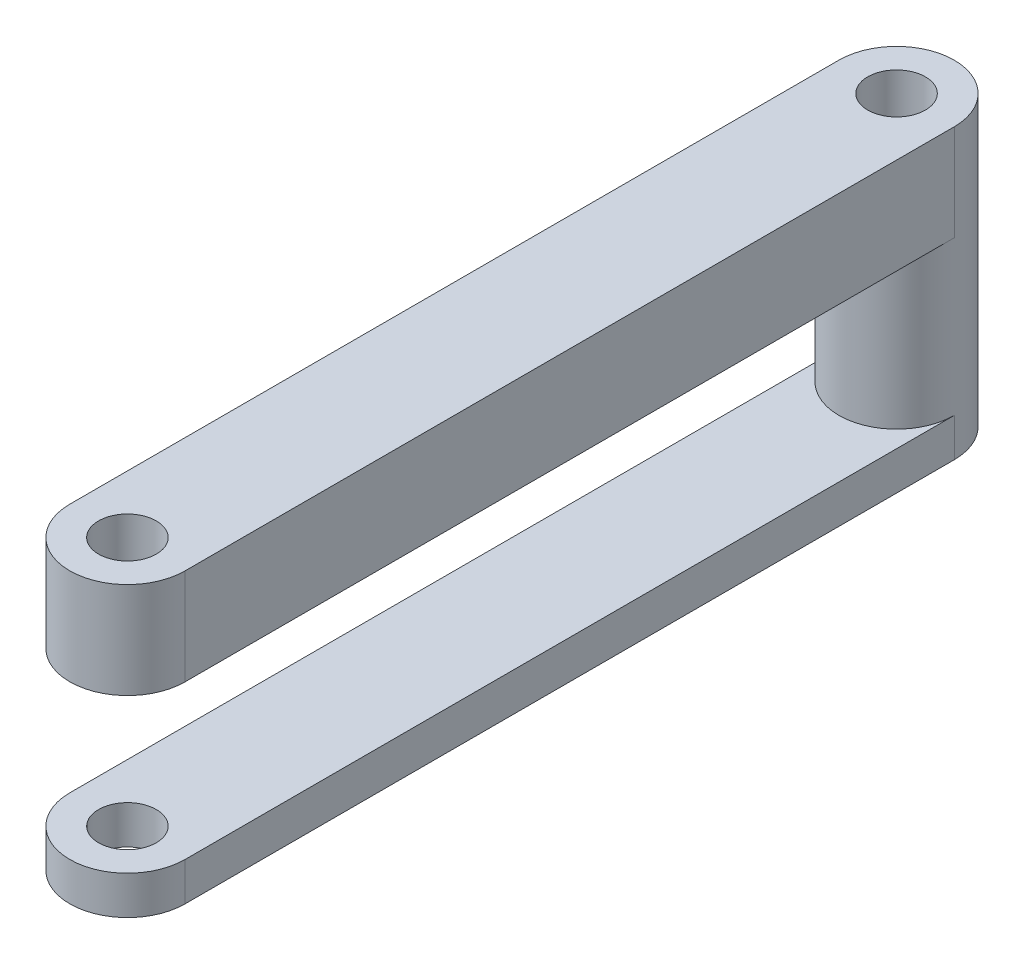
ISO-10303-21;
HEADER;
FILE_DESCRIPTION(('STEP AP214'),'2;1');
FILE_NAME('part.step','',(''),(''),'','','');
FILE_SCHEMA(('AUTOMOTIVE_DESIGN { 1 0 10303 214 1 1 1 1 }'));
ENDSEC;
DATA;
#1=APPLICATION_CONTEXT('core data for automotive mechanical design processes');
#2=APPLICATION_PROTOCOL_DEFINITION('international standard','automotive_design',2000,#1);
#3=PRODUCT_CONTEXT('',#1,'mechanical');
#4=PRODUCT('Part','Part','',(#3));
#5=PRODUCT_RELATED_PRODUCT_CATEGORY('part','',(#4));
#6=PRODUCT_DEFINITION_FORMATION('','',#4);
#7=PRODUCT_DEFINITION_CONTEXT('part definition',#1,'design');
#8=PRODUCT_DEFINITION('design','',#6,#7);
#9=PRODUCT_DEFINITION_SHAPE('','',#8);
#10=(LENGTH_UNIT() NAMED_UNIT(*) SI_UNIT(.MILLI.,.METRE.));
#11=(NAMED_UNIT(*) PLANE_ANGLE_UNIT() SI_UNIT($,.RADIAN.));
#12=(NAMED_UNIT(*) SI_UNIT($,.STERADIAN.) SOLID_ANGLE_UNIT());
#13=UNCERTAINTY_MEASURE_WITH_UNIT(LENGTH_MEASURE(1.E-05),#10,'distance_accuracy_value','');
#14=(GEOMETRIC_REPRESENTATION_CONTEXT(3) GLOBAL_UNCERTAINTY_ASSIGNED_CONTEXT((#13)) GLOBAL_UNIT_ASSIGNED_CONTEXT((#10,
#11,#12)) REPRESENTATION_CONTEXT('',''));
#15=CARTESIAN_POINT('',(0.,0.,0.));
#16=DIRECTION('',(0.,0.,1.));
#17=DIRECTION('',(1.,0.,0.));
#18=AXIS2_PLACEMENT_3D('',#15,#16,#17);
#19=CARTESIAN_POINT('',(0.,2.,0.));
#20=DIRECTION('',(0.,-1.,0.));
#21=DIRECTION('',(0.,0.,-1.));
#22=AXIS2_PLACEMENT_3D('',#19,#20,#21);
#23=CYLINDRICAL_SURFACE('',#22,3.);
#24=CARTESIAN_POINT('',(0.,0.,0.));
#25=DIRECTION('',(0.,1.,0.));
#26=DIRECTION('',(0.,0.,1.));
#27=AXIS2_PLACEMENT_3D('',#24,#25,#26);
#28=CIRCLE('',#27,3.);
#29=CARTESIAN_POINT('',(3.,0.,0.));
#30=VERTEX_POINT('',#29);
#31=CARTESIAN_POINT('',(-3.,0.,0.));
#32=VERTEX_POINT('',#31);
#33=EDGE_CURVE('E112',#30,#32,#28,.T.);
#34=ORIENTED_EDGE('',*,*,#33,.T.);
#35=DIRECTION('',(0.,-1.,0.));
#36=VECTOR('',#35,1.);
#37=CARTESIAN_POINT('',(-3.,2.,0.));
#38=LINE('',#37,#36);
#39=CARTESIAN_POINT('',(-3.,2.,0.));
#40=VERTEX_POINT('',#39);
#41=EDGE_CURVE('E123',#40,#32,#38,.T.);
#42=ORIENTED_EDGE('',*,*,#41,.F.);
#43=CARTESIAN_POINT('',(0.,2.,0.));
#44=DIRECTION('',(0.,1.,0.));
#45=DIRECTION('',(0.,0.,1.));
#46=AXIS2_PLACEMENT_3D('',#43,#44,#45);
#47=CIRCLE('',#46,3.);
#48=CARTESIAN_POINT('',(3.,2.,0.));
#49=VERTEX_POINT('',#48);
#50=EDGE_CURVE('E41',#40,#49,#47,.T.);
#51=ORIENTED_EDGE('',*,*,#50,.T.);
#52=DIRECTION('',(0.,-1.,0.));
#53=VECTOR('',#52,1.);
#54=CARTESIAN_POINT('',(3.,2.,0.));
#55=LINE('',#54,#53);
#56=EDGE_CURVE('E131',#49,#30,#55,.T.);
#57=ORIENTED_EDGE('',*,*,#56,.T.);
#58=EDGE_LOOP('',(#34,#42,#51,#57));
#59=FACE_BOUND('',#58,.T.);
#60=CARTESIAN_POINT('',(0.,10.,0.));
#61=DIRECTION('',(0.,1.,0.));
#62=DIRECTION('',(0.,0.,1.));
#63=AXIS2_PLACEMENT_3D('',#60,#61,#62);
#64=CIRCLE('',#63,3.);
#65=CARTESIAN_POINT('',(-3.,10.,0.));
#66=VERTEX_POINT('',#65);
#67=CARTESIAN_POINT('',(3.,10.,0.));
#68=VERTEX_POINT('',#67);
#69=EDGE_CURVE('E11',#66,#68,#64,.T.);
#70=ORIENTED_EDGE('',*,*,#69,.F.);
#71=DIRECTION('',(0.,-1.,0.));
#72=VECTOR('',#71,1.);
#73=CARTESIAN_POINT('',(-3.,15.,0.));
#74=LINE('',#73,#72);
#75=CARTESIAN_POINT('',(-3.,15.,0.));
#76=VERTEX_POINT('',#75);
#77=EDGE_CURVE('E55',#76,#66,#74,.T.);
#78=ORIENTED_EDGE('',*,*,#77,.F.);
#79=CARTESIAN_POINT('',(0.,15.,0.));
#80=DIRECTION('',(0.,1.,0.));
#81=DIRECTION('',(0.,0.,1.));
#82=AXIS2_PLACEMENT_3D('',#79,#80,#81);
#83=CIRCLE('',#82,3.);
#84=CARTESIAN_POINT('',(3.,15.,0.));
#85=VERTEX_POINT('',#84);
#86=EDGE_CURVE('E103',#85,#76,#83,.T.);
#87=ORIENTED_EDGE('',*,*,#86,.F.);
#88=DIRECTION('',(0.,-1.,0.));
#89=VECTOR('',#88,1.);
#90=CARTESIAN_POINT('',(3.,15.,0.));
#91=LINE('',#90,#89);
#92=EDGE_CURVE('E48',#85,#68,#91,.T.);
#93=ORIENTED_EDGE('',*,*,#92,.T.);
#94=EDGE_LOOP('',(#70,#78,#87,#93));
#95=FACE_BOUND('',#94,.T.);
#96=ADVANCED_FACE('F33',(#59,#95),#23,.T.);
#97=CARTESIAN_POINT('',(-3.,2.,0.));
#98=DIRECTION('',(1.,0.,0.));
#99=DIRECTION('',(0.,0.,-1.));
#100=AXIS2_PLACEMENT_3D('',#97,#98,#99);
#101=PLANE('',#100);
#102=DIRECTION('',(0.,0.,1.));
#103=VECTOR('',#102,1.);
#104=CARTESIAN_POINT('',(-3.,0.,0.));
#105=LINE('',#104,#103);
#106=CARTESIAN_POINT('',(-3.,0.,40.));
#107=VERTEX_POINT('',#106);
#108=EDGE_CURVE('E115',#32,#107,#105,.T.);
#109=ORIENTED_EDGE('',*,*,#108,.T.);
#110=DIRECTION('',(0.,-1.,0.));
#111=VECTOR('',#110,1.);
#112=CARTESIAN_POINT('',(-3.,2.,40.));
#113=LINE('',#112,#111);
#114=CARTESIAN_POINT('',(-3.,2.,40.));
#115=VERTEX_POINT('',#114);
#116=EDGE_CURVE('E142',#115,#107,#113,.T.);
#117=ORIENTED_EDGE('',*,*,#116,.F.);
#118=DIRECTION('',(0.,0.,1.));
#119=VECTOR('',#118,1.);
#120=CARTESIAN_POINT('',(-3.,2.,0.));
#121=LINE('',#120,#119);
#122=EDGE_CURVE('E124',#40,#115,#121,.T.);
#123=ORIENTED_EDGE('',*,*,#122,.F.);
#124=ORIENTED_EDGE('',*,*,#41,.T.);
#125=EDGE_LOOP('',(#109,#117,#123,#124));
#126=FACE_BOUND('',#125,.T.);
#127=ADVANCED_FACE('F149',(#126),#101,.F.);
#128=CARTESIAN_POINT('',(0.,2.,40.));
#129=DIRECTION('',(0.,-1.,0.));
#130=DIRECTION('',(0.,0.,-1.));
#131=AXIS2_PLACEMENT_3D('',#128,#129,#130);
#132=CYLINDRICAL_SURFACE('',#131,3.);
#133=CARTESIAN_POINT('',(0.,0.,40.));
#134=DIRECTION('',(0.,1.,0.));
#135=DIRECTION('',(0.,0.,1.));
#136=AXIS2_PLACEMENT_3D('',#133,#134,#135);
#137=CIRCLE('',#136,3.);
#138=CARTESIAN_POINT('',(3.00000000000001,0.,40.));
#139=VERTEX_POINT('',#138);
#140=EDGE_CURVE('E134',#107,#139,#137,.T.);
#141=ORIENTED_EDGE('',*,*,#140,.T.);
#142=DIRECTION('',(0.,-1.,0.));
#143=VECTOR('',#142,1.);
#144=CARTESIAN_POINT('',(3.00000000000001,2.,40.));
#145=LINE('',#144,#143);
#146=CARTESIAN_POINT('',(3.00000000000001,2.,40.));
#147=VERTEX_POINT('',#146);
#148=EDGE_CURVE('E140',#147,#139,#145,.T.);
#149=ORIENTED_EDGE('',*,*,#148,.F.);
#150=CARTESIAN_POINT('',(0.,2.,40.));
#151=DIRECTION('',(0.,1.,0.));
#152=DIRECTION('',(0.,0.,1.));
#153=AXIS2_PLACEMENT_3D('',#150,#151,#152);
#154=CIRCLE('',#153,3.);
#155=EDGE_CURVE('E126',#115,#147,#154,.T.);
#156=ORIENTED_EDGE('',*,*,#155,.F.);
#157=ORIENTED_EDGE('',*,*,#116,.T.);
#158=EDGE_LOOP('',(#141,#149,#156,#157));
#159=FACE_BOUND('',#158,.T.);
#160=ADVANCED_FACE('F163',(#159),#132,.T.);
#161=CARTESIAN_POINT('',(3.,2.,0.));
#162=DIRECTION('',(1.,0.,0.));
#163=DIRECTION('',(0.,0.,-1.));
#164=AXIS2_PLACEMENT_3D('',#161,#162,#163);
#165=PLANE('',#164);
#166=DIRECTION('',(0.,0.,1.));
#167=VECTOR('',#166,1.);
#168=CARTESIAN_POINT('',(3.,0.,0.));
#169=LINE('',#168,#167);
#170=EDGE_CURVE('E127',#30,#139,#169,.T.);
#171=ORIENTED_EDGE('',*,*,#170,.F.);
#172=ORIENTED_EDGE('',*,*,#56,.F.);
#173=DIRECTION('',(0.,0.,1.));
#174=VECTOR('',#173,1.);
#175=CARTESIAN_POINT('',(3.,2.,0.));
#176=LINE('',#175,#174);
#177=EDGE_CURVE('E129',#49,#147,#176,.T.);
#178=ORIENTED_EDGE('',*,*,#177,.T.);
#179=ORIENTED_EDGE('',*,*,#148,.T.);
#180=EDGE_LOOP('',(#171,#172,#178,#179));
#181=FACE_BOUND('',#180,.T.);
#182=ADVANCED_FACE('F159',(#181),#165,.T.);
#183=CARTESIAN_POINT('',(0.,2.,0.));
#184=DIRECTION('',(0.,1.,0.));
#185=DIRECTION('',(0.,0.,1.));
#186=AXIS2_PLACEMENT_3D('',#183,#184,#185);
#187=PLANE('',#186);
#188=CARTESIAN_POINT('',(0.,2.,40.));
#189=DIRECTION('',(0.,1.,0.));
#190=DIRECTION('',(0.,0.,1.));
#191=AXIS2_PLACEMENT_3D('',#188,#189,#190);
#192=CIRCLE('',#191,1.5);
#193=CARTESIAN_POINT('',(0.,2.,41.5));
#194=VERTEX_POINT('',#193);
#195=EDGE_CURVE('E307',#194,#194,#192,.T.);
#196=ORIENTED_EDGE('',*,*,#195,.F.);
#197=EDGE_LOOP('',(#196));
#198=FACE_BOUND('',#197,.T.);
#199=ORIENTED_EDGE('',*,*,#50,.F.);
#200=ORIENTED_EDGE('',*,*,#122,.T.);
#201=ORIENTED_EDGE('',*,*,#155,.T.);
#202=ORIENTED_EDGE('',*,*,#177,.F.);
#203=EDGE_LOOP('',(#199,#200,#201,#202));
#204=FACE_BOUND('',#203,.T.);
#205=ADVANCED_FACE('F165',(#198,#204),#187,.T.);
#206=CARTESIAN_POINT('',(0.,0.,0.));
#207=DIRECTION('',(0.,1.,0.));
#208=DIRECTION('',(0.,0.,1.));
#209=AXIS2_PLACEMENT_3D('',#206,#207,#208);
#210=PLANE('',#209);
#211=CARTESIAN_POINT('',(0.,0.,0.));
#212=DIRECTION('',(0.,1.,0.));
#213=DIRECTION('',(0.,0.,1.));
#214=AXIS2_PLACEMENT_3D('',#211,#212,#213);
#215=CIRCLE('',#214,1.5);
#216=CARTESIAN_POINT('',(0.,0.,1.5));
#217=VERTEX_POINT('',#216);
#218=EDGE_CURVE('E294',#217,#217,#215,.T.);
#219=ORIENTED_EDGE('',*,*,#218,.T.);
#220=EDGE_LOOP('',(#219));
#221=FACE_BOUND('',#220,.T.);
#222=CARTESIAN_POINT('',(0.,0.,40.));
#223=DIRECTION('',(0.,1.,0.));
#224=DIRECTION('',(0.,0.,1.));
#225=AXIS2_PLACEMENT_3D('',#222,#223,#224);
#226=CIRCLE('',#225,1.5);
#227=CARTESIAN_POINT('',(0.,0.,41.5));
#228=VERTEX_POINT('',#227);
#229=EDGE_CURVE('E304',#228,#228,#226,.T.);
#230=ORIENTED_EDGE('',*,*,#229,.T.);
#231=EDGE_LOOP('',(#230));
#232=FACE_BOUND('',#231,.T.);
#233=ORIENTED_EDGE('',*,*,#33,.F.);
#234=ORIENTED_EDGE('',*,*,#170,.T.);
#235=ORIENTED_EDGE('',*,*,#140,.F.);
#236=ORIENTED_EDGE('',*,*,#108,.F.);
#237=EDGE_LOOP('',(#233,#234,#235,#236));
#238=FACE_BOUND('',#237,.T.);
#239=ADVANCED_FACE('F156',(#221,#232,#238),#210,.F.);
#240=CARTESIAN_POINT('',(-3.,15.,0.));
#241=DIRECTION('',(1.,0.,0.));
#242=DIRECTION('',(0.,0.,-1.));
#243=AXIS2_PLACEMENT_3D('',#240,#241,#242);
#244=PLANE('',#243);
#245=DIRECTION('',(0.,0.,1.));
#246=VECTOR('',#245,1.);
#247=CARTESIAN_POINT('',(-3.,10.,0.));
#248=LINE('',#247,#246);
#249=CARTESIAN_POINT('',(-3.,10.,40.));
#250=VERTEX_POINT('',#249);
#251=EDGE_CURVE('E309',#66,#250,#248,.T.);
#252=ORIENTED_EDGE('',*,*,#251,.T.);
#253=DIRECTION('',(0.,-1.,0.));
#254=VECTOR('',#253,1.);
#255=CARTESIAN_POINT('',(-3.,15.,40.));
#256=LINE('',#255,#254);
#257=CARTESIAN_POINT('',(-3.,15.,40.));
#258=VERTEX_POINT('',#257);
#259=EDGE_CURVE('E99',#258,#250,#256,.T.);
#260=ORIENTED_EDGE('',*,*,#259,.F.);
#261=DIRECTION('',(0.,0.,1.));
#262=VECTOR('',#261,1.);
#263=CARTESIAN_POINT('',(-3.,15.,0.));
#264=LINE('',#263,#262);
#265=EDGE_CURVE('E95',#76,#258,#264,.T.);
#266=ORIENTED_EDGE('',*,*,#265,.F.);
#267=ORIENTED_EDGE('',*,*,#77,.T.);
#268=EDGE_LOOP('',(#252,#260,#266,#267));
#269=FACE_BOUND('',#268,.T.);
#270=ADVANCED_FACE('F97',(#269),#244,.F.);
#271=CARTESIAN_POINT('',(0.,15.,40.));
#272=DIRECTION('',(0.,-1.,0.));
#273=DIRECTION('',(0.,0.,-1.));
#274=AXIS2_PLACEMENT_3D('',#271,#272,#273);
#275=CYLINDRICAL_SURFACE('',#274,3.);
#276=CARTESIAN_POINT('',(0.,10.,40.));
#277=DIRECTION('',(0.,1.,0.));
#278=DIRECTION('',(0.,0.,1.));
#279=AXIS2_PLACEMENT_3D('',#276,#277,#278);
#280=CIRCLE('',#279,3.);
#281=CARTESIAN_POINT('',(3.00000000000001,10.,40.));
#282=VERTEX_POINT('',#281);
#283=EDGE_CURVE('E314',#250,#282,#280,.T.);
#284=ORIENTED_EDGE('',*,*,#283,.T.);
#285=DIRECTION('',(0.,-1.,0.));
#286=VECTOR('',#285,1.);
#287=CARTESIAN_POINT('',(3.00000000000001,15.,40.));
#288=LINE('',#287,#286);
#289=CARTESIAN_POINT('',(3.00000000000001,15.,40.));
#290=VERTEX_POINT('',#289);
#291=EDGE_CURVE('E117',#290,#282,#288,.T.);
#292=ORIENTED_EDGE('',*,*,#291,.F.);
#293=CARTESIAN_POINT('',(0.,15.,40.));
#294=DIRECTION('',(0.,1.,0.));
#295=DIRECTION('',(0.,0.,1.));
#296=AXIS2_PLACEMENT_3D('',#293,#294,#295);
#297=CIRCLE('',#296,3.);
#298=EDGE_CURVE('E102',#258,#290,#297,.T.);
#299=ORIENTED_EDGE('',*,*,#298,.F.);
#300=ORIENTED_EDGE('',*,*,#259,.T.);
#301=EDGE_LOOP('',(#284,#292,#299,#300));
#302=FACE_BOUND('',#301,.T.);
#303=ADVANCED_FACE('F211',(#302),#275,.T.);
#304=CARTESIAN_POINT('',(3.,15.,0.));
#305=DIRECTION('',(-1.,0.,0.));
#306=DIRECTION('',(0.,0.,1.));
#307=AXIS2_PLACEMENT_3D('',#304,#305,#306);
#308=PLANE('',#307);
#309=DIRECTION('',(0.,0.,-1.));
#310=VECTOR('',#309,1.);
#311=CARTESIAN_POINT('',(3.,10.,0.));
#312=LINE('',#311,#310);
#313=EDGE_CURVE('E109',#282,#68,#312,.T.);
#314=ORIENTED_EDGE('',*,*,#313,.T.);
#315=ORIENTED_EDGE('',*,*,#92,.F.);
#316=DIRECTION('',(0.,0.,-1.));
#317=VECTOR('',#316,1.);
#318=CARTESIAN_POINT('',(3.,15.,0.));
#319=LINE('',#318,#317);
#320=EDGE_CURVE('E108',#290,#85,#319,.T.);
#321=ORIENTED_EDGE('',*,*,#320,.F.);
#322=ORIENTED_EDGE('',*,*,#291,.T.);
#323=EDGE_LOOP('',(#314,#315,#321,#322));
#324=FACE_BOUND('',#323,.T.);
#325=ADVANCED_FACE('F219',(#324),#308,.F.);
#326=CARTESIAN_POINT('',(0.,15.,0.));
#327=DIRECTION('',(0.,1.,0.));
#328=DIRECTION('',(0.,0.,1.));
#329=AXIS2_PLACEMENT_3D('',#326,#327,#328);
#330=PLANE('',#329);
#331=CARTESIAN_POINT('',(0.,15.,0.));
#332=DIRECTION('',(0.,1.,0.));
#333=DIRECTION('',(0.,0.,1.));
#334=AXIS2_PLACEMENT_3D('',#331,#332,#333);
#335=CIRCLE('',#334,1.5);
#336=CARTESIAN_POINT('',(0.,15.,1.5));
#337=VERTEX_POINT('',#336);
#338=EDGE_CURVE('E297',#337,#337,#335,.T.);
#339=ORIENTED_EDGE('',*,*,#338,.F.);
#340=EDGE_LOOP('',(#339));
#341=FACE_BOUND('',#340,.T.);
#342=CARTESIAN_POINT('',(0.,15.,40.));
#343=DIRECTION('',(0.,1.,0.));
#344=DIRECTION('',(0.,0.,1.));
#345=AXIS2_PLACEMENT_3D('',#342,#343,#344);
#346=CIRCLE('',#345,1.5);
#347=CARTESIAN_POINT('',(0.,15.,41.5));
#348=VERTEX_POINT('',#347);
#349=EDGE_CURVE('E299',#348,#348,#346,.T.);
#350=ORIENTED_EDGE('',*,*,#349,.F.);
#351=EDGE_LOOP('',(#350));
#352=FACE_BOUND('',#351,.T.);
#353=ORIENTED_EDGE('',*,*,#86,.T.);
#354=ORIENTED_EDGE('',*,*,#265,.T.);
#355=ORIENTED_EDGE('',*,*,#298,.T.);
#356=ORIENTED_EDGE('',*,*,#320,.T.);
#357=EDGE_LOOP('',(#353,#354,#355,#356));
#358=FACE_BOUND('',#357,.T.);
#359=ADVANCED_FACE('F106',(#341,#352,#358),#330,.T.);
#360=CARTESIAN_POINT('',(0.,10.,0.));
#361=DIRECTION('',(0.,1.,0.));
#362=DIRECTION('',(0.,0.,1.));
#363=AXIS2_PLACEMENT_3D('',#360,#361,#362);
#364=PLANE('',#363);
#365=CARTESIAN_POINT('',(0.,10.,40.));
#366=DIRECTION('',(0.,1.,0.));
#367=DIRECTION('',(0.,0.,1.));
#368=AXIS2_PLACEMENT_3D('',#365,#366,#367);
#369=CIRCLE('',#368,1.5);
#370=CARTESIAN_POINT('',(0.,10.,41.5));
#371=VERTEX_POINT('',#370);
#372=EDGE_CURVE('E36',#371,#371,#369,.T.);
#373=ORIENTED_EDGE('',*,*,#372,.T.);
#374=EDGE_LOOP('',(#373));
#375=FACE_BOUND('',#374,.T.);
#376=ORIENTED_EDGE('',*,*,#251,.F.);
#377=ORIENTED_EDGE('',*,*,#69,.T.);
#378=ORIENTED_EDGE('',*,*,#313,.F.);
#379=ORIENTED_EDGE('',*,*,#283,.F.);
#380=EDGE_LOOP('',(#376,#377,#378,#379));
#381=FACE_BOUND('',#380,.T.);
#382=ADVANCED_FACE('F248',(#375,#381),#364,.F.);
#383=CARTESIAN_POINT('',(0.,15.,40.));
#384=DIRECTION('',(0.,1.,0.));
#385=DIRECTION('',(0.,0.,1.));
#386=AXIS2_PLACEMENT_3D('',#383,#384,#385);
#387=CYLINDRICAL_SURFACE('',#386,1.5);
#388=ORIENTED_EDGE('',*,*,#349,.T.);
#389=EDGE_LOOP('',(#388));
#390=FACE_BOUND('',#389,.T.);
#391=ORIENTED_EDGE('',*,*,#372,.F.);
#392=EDGE_LOOP('',(#391));
#393=FACE_BOUND('',#392,.T.);
#394=ADVANCED_FACE('F258',(#390,#393),#387,.F.);
#395=ORIENTED_EDGE('',*,*,#195,.T.);
#396=EDGE_LOOP('',(#395));
#397=FACE_BOUND('',#396,.T.);
#398=ORIENTED_EDGE('',*,*,#229,.F.);
#399=EDGE_LOOP('',(#398));
#400=FACE_BOUND('',#399,.T.);
#401=ADVANCED_FACE('F268',(#397,#400),#387,.F.);
#402=CARTESIAN_POINT('',(0.,15.,0.));
#403=DIRECTION('',(0.,1.,0.));
#404=DIRECTION('',(0.,0.,1.));
#405=AXIS2_PLACEMENT_3D('',#402,#403,#404);
#406=CYLINDRICAL_SURFACE('',#405,1.5);
#407=ORIENTED_EDGE('',*,*,#218,.F.);
#408=EDGE_LOOP('',(#407));
#409=FACE_BOUND('',#408,.T.);
#410=ORIENTED_EDGE('',*,*,#338,.T.);
#411=EDGE_LOOP('',(#410));
#412=FACE_BOUND('',#411,.T.);
#413=ADVANCED_FACE('F278',(#409,#412),#406,.F.);
#414=CLOSED_SHELL('',(#96,#127,#160,#182,#205,#239,#270,#303,#325,#359,#382,#394,#401,#413));
#415=MANIFOLD_SOLID_BREP('B2',#414);
#416=ADVANCED_BREP_SHAPE_REPRESENTATION('',(#18,#415),#14);
#417=SHAPE_DEFINITION_REPRESENTATION(#9,#416);
ENDSEC;
END-ISO-10303-21;
